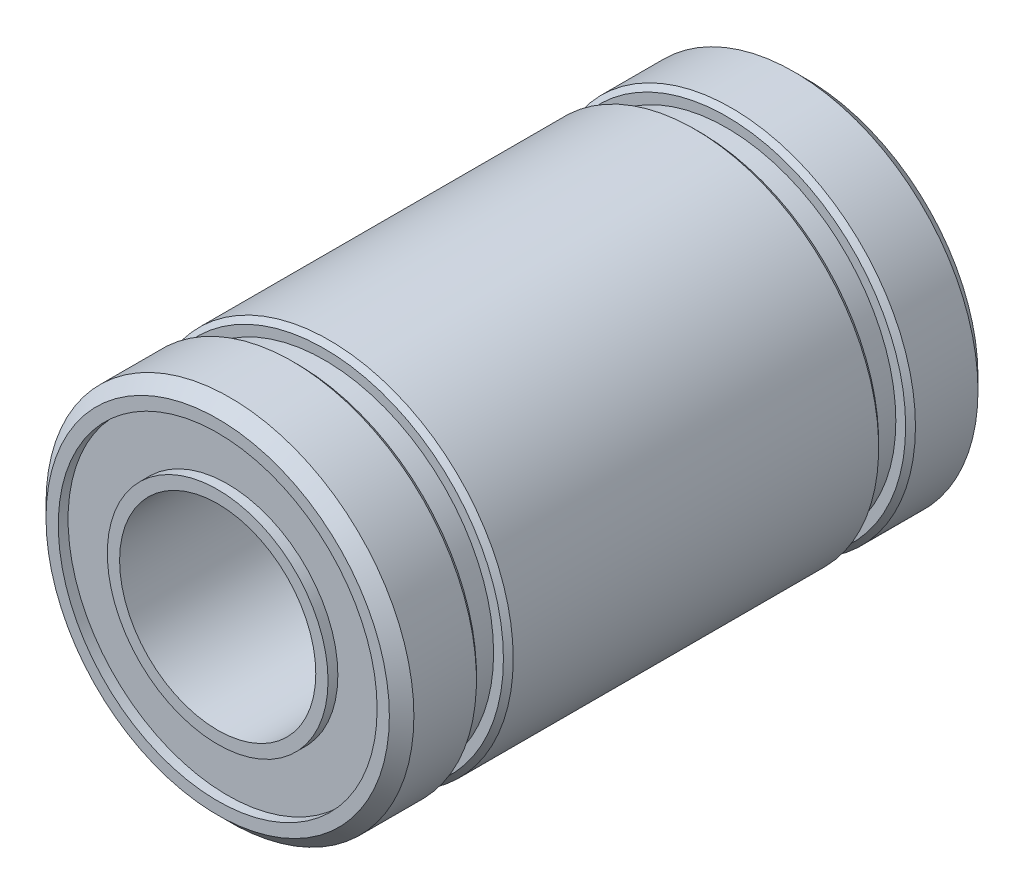
ISO-10303-21;
HEADER;
FILE_DESCRIPTION(('STEP AP214'),'2;1');
FILE_NAME('part.step','',(''),(''),'','','');
FILE_SCHEMA(('AUTOMOTIVE_DESIGN { 1 0 10303 214 1 1 1 1 }'));
ENDSEC;
DATA;
#1=APPLICATION_CONTEXT('core data for automotive mechanical design processes');
#2=APPLICATION_PROTOCOL_DEFINITION('international standard','automotive_design',2000,#1);
#3=PRODUCT_CONTEXT('',#1,'mechanical');
#4=PRODUCT('Part','Part','',(#3));
#5=PRODUCT_RELATED_PRODUCT_CATEGORY('part','',(#4));
#6=PRODUCT_DEFINITION_FORMATION('','',#4);
#7=PRODUCT_DEFINITION_CONTEXT('part definition',#1,'design');
#8=PRODUCT_DEFINITION('design','',#6,#7);
#9=PRODUCT_DEFINITION_SHAPE('','',#8);
#10=(LENGTH_UNIT() NAMED_UNIT(*) SI_UNIT(.MILLI.,.METRE.));
#11=(NAMED_UNIT(*) PLANE_ANGLE_UNIT() SI_UNIT($,.RADIAN.));
#12=(NAMED_UNIT(*) SI_UNIT($,.STERADIAN.) SOLID_ANGLE_UNIT());
#13=UNCERTAINTY_MEASURE_WITH_UNIT(LENGTH_MEASURE(1.E-05),#10,'distance_accuracy_value','');
#14=(GEOMETRIC_REPRESENTATION_CONTEXT(3) GLOBAL_UNCERTAINTY_ASSIGNED_CONTEXT((#13)) GLOBAL_UNIT_ASSIGNED_CONTEXT((#10,
#11,#12)) REPRESENTATION_CONTEXT('',''));
#15=CARTESIAN_POINT('',(0.,0.,0.));
#16=DIRECTION('',(0.,0.,1.));
#17=DIRECTION('',(1.,0.,0.));
#18=AXIS2_PLACEMENT_3D('',#15,#16,#17);
#19=CARTESIAN_POINT('',(0.,0.,24.));
#20=DIRECTION('',(0.,0.,-1.));
#21=DIRECTION('',(-1.,0.,0.));
#22=AXIS2_PLACEMENT_3D('',#19,#20,#21);
#23=CYLINDRICAL_SURFACE('',#22,7.5);
#24=CARTESIAN_POINT('',(0.,0.,20.95));
#25=DIRECTION('',(0.,0.,-1.));
#26=DIRECTION('',(-1.,0.,0.));
#27=AXIS2_PLACEMENT_3D('',#24,#25,#26);
#28=CIRCLE('',#27,7.5);
#29=CARTESIAN_POINT('',(-7.5,0.,20.95));
#30=VERTEX_POINT('',#29);
#31=EDGE_CURVE('E53',#30,#30,#28,.F.);
#32=ORIENTED_EDGE('',*,*,#31,.T.);
#33=EDGE_LOOP('',(#32));
#34=FACE_BOUND('',#33,.T.);
#35=CARTESIAN_POINT('',(0.,0.,23.5));
#36=DIRECTION('',(0.,0.,1.));
#37=DIRECTION('',(1.,0.,0.));
#38=AXIS2_PLACEMENT_3D('',#35,#36,#37);
#39=CIRCLE('',#38,7.5);
#40=CARTESIAN_POINT('',(7.5,0.,23.5));
#41=VERTEX_POINT('',#40);
#42=EDGE_CURVE('E78',#41,#41,#39,.F.);
#43=ORIENTED_EDGE('',*,*,#42,.T.);
#44=EDGE_LOOP('',(#43));
#45=FACE_BOUND('',#44,.T.);
#46=ADVANCED_FACE('F45',(#34,#45),#23,.T.);
#47=CARTESIAN_POINT('',(0.,0.,3.05));
#48=DIRECTION('',(0.,0.,1.));
#49=DIRECTION('',(1.,0.,0.));
#50=AXIS2_PLACEMENT_3D('',#47,#48,#49);
#51=CIRCLE('',#50,7.5);
#52=CARTESIAN_POINT('',(7.5,0.,3.05));
#53=VERTEX_POINT('',#52);
#54=EDGE_CURVE('E72',#53,#53,#51,.F.);
#55=ORIENTED_EDGE('',*,*,#54,.T.);
#56=EDGE_LOOP('',(#55));
#57=FACE_BOUND('',#56,.T.);
#58=CARTESIAN_POINT('',(0.,0.,0.500000000000004));
#59=DIRECTION('',(0.,0.,1.));
#60=DIRECTION('',(1.,0.,0.));
#61=AXIS2_PLACEMENT_3D('',#58,#59,#60);
#62=CIRCLE('',#61,7.5);
#63=CARTESIAN_POINT('',(7.5,0.,0.500000000000004));
#64=VERTEX_POINT('',#63);
#65=EDGE_CURVE('E87',#64,#64,#62,.T.);
#66=ORIENTED_EDGE('',*,*,#65,.T.);
#67=EDGE_LOOP('',(#66));
#68=FACE_BOUND('',#67,.T.);
#69=ADVANCED_FACE('F151',(#57,#68),#23,.T.);
#70=CARTESIAN_POINT('',(0.,0.,0.));
#71=DIRECTION('',(0.,0.,1.));
#72=DIRECTION('',(1.,0.,0.));
#73=AXIS2_PLACEMENT_3D('',#70,#71,#72);
#74=PLANE('',#73);
#75=CARTESIAN_POINT('',(0.,0.,0.));
#76=DIRECTION('',(0.,0.,1.));
#77=DIRECTION('',(1.,0.,0.));
#78=AXIS2_PLACEMENT_3D('',#75,#76,#77);
#79=CIRCLE('',#78,4.);
#80=CARTESIAN_POINT('',(4.,0.,0.));
#81=VERTEX_POINT('',#80);
#82=EDGE_CURVE('E103',#81,#81,#79,.T.);
#83=ORIENTED_EDGE('',*,*,#82,.T.);
#84=EDGE_LOOP('',(#83));
#85=FACE_BOUND('',#84,.T.);
#86=CARTESIAN_POINT('',(0.,0.,0.));
#87=DIRECTION('',(0.,0.,1.));
#88=DIRECTION('',(1.,0.,0.));
#89=AXIS2_PLACEMENT_3D('',#86,#87,#88);
#90=CIRCLE('',#89,4.5);
#91=CARTESIAN_POINT('',(4.5,0.,0.));
#92=VERTEX_POINT('',#91);
#93=EDGE_CURVE('E90',#92,#92,#90,.T.);
#94=ORIENTED_EDGE('',*,*,#93,.F.);
#95=EDGE_LOOP('',(#94));
#96=FACE_BOUND('',#95,.T.);
#97=ADVANCED_FACE('F157',(#85,#96),#74,.F.);
#98=CARTESIAN_POINT('',(0.,0.,0.400000000000001));
#99=DIRECTION('',(0.,0.,-1.));
#100=DIRECTION('',(1.,0.,0.));
#101=AXIS2_PLACEMENT_3D('',#98,#99,#100);
#102=CYLINDRICAL_SURFACE('',#101,4.5);
#103=CARTESIAN_POINT('',(0.,0.,0.400000000000001));
#104=DIRECTION('',(0.,0.,1.));
#105=DIRECTION('',(1.,0.,0.));
#106=AXIS2_PLACEMENT_3D('',#103,#104,#105);
#107=CIRCLE('',#106,4.5);
#108=CARTESIAN_POINT('',(4.5,0.,0.400000000000001));
#109=VERTEX_POINT('',#108);
#110=EDGE_CURVE('E93',#109,#109,#107,.T.);
#111=ORIENTED_EDGE('',*,*,#110,.F.);
#112=EDGE_LOOP('',(#111));
#113=FACE_BOUND('',#112,.T.);
#114=ORIENTED_EDGE('',*,*,#93,.T.);
#115=EDGE_LOOP('',(#114));
#116=FACE_BOUND('',#115,.T.);
#117=ADVANCED_FACE('F212',(#113,#116),#102,.T.);
#118=CARTESIAN_POINT('',(0.,0.,0.400000000000001));
#119=DIRECTION('',(0.,0.,-1.));
#120=DIRECTION('',(1.,0.,0.));
#121=AXIS2_PLACEMENT_3D('',#118,#119,#120);
#122=PLANE('',#121);
#123=ORIENTED_EDGE('',*,*,#110,.T.);
#124=EDGE_LOOP('',(#123));
#125=FACE_BOUND('',#124,.T.);
#126=CARTESIAN_POINT('',(0.,0.,0.400000000000001));
#127=DIRECTION('',(0.,0.,1.));
#128=DIRECTION('',(1.,0.,0.));
#129=AXIS2_PLACEMENT_3D('',#126,#127,#128);
#130=CIRCLE('',#129,6.5);
#131=CARTESIAN_POINT('',(6.5,0.,0.400000000000001));
#132=VERTEX_POINT('',#131);
#133=EDGE_CURVE('E99',#132,#132,#130,.T.);
#134=ORIENTED_EDGE('',*,*,#133,.F.);
#135=EDGE_LOOP('',(#134));
#136=FACE_BOUND('',#135,.T.);
#137=ADVANCED_FACE('F215',(#125,#136),#122,.T.);
#138=CARTESIAN_POINT('',(0.,0.,0.400000000000001));
#139=DIRECTION('',(0.,0.,-1.));
#140=DIRECTION('',(1.,0.,0.));
#141=AXIS2_PLACEMENT_3D('',#138,#139,#140);
#142=CYLINDRICAL_SURFACE('',#141,6.5);
#143=ORIENTED_EDGE('',*,*,#133,.T.);
#144=EDGE_LOOP('',(#143));
#145=FACE_BOUND('',#144,.T.);
#146=CARTESIAN_POINT('',(0.,0.,0.));
#147=DIRECTION('',(0.,0.,1.));
#148=DIRECTION('',(1.,0.,0.));
#149=AXIS2_PLACEMENT_3D('',#146,#147,#148);
#150=CIRCLE('',#149,6.5);
#151=CARTESIAN_POINT('',(6.5,0.,0.));
#152=VERTEX_POINT('',#151);
#153=EDGE_CURVE('E96',#152,#152,#150,.T.);
#154=ORIENTED_EDGE('',*,*,#153,.F.);
#155=EDGE_LOOP('',(#154));
#156=FACE_BOUND('',#155,.T.);
#157=ADVANCED_FACE('F218',(#145,#156),#142,.F.);
#158=CARTESIAN_POINT('',(0.,0.,24.));
#159=DIRECTION('',(0.,0.,1.));
#160=DIRECTION('',(1.,0.,0.));
#161=AXIS2_PLACEMENT_3D('',#158,#159,#160);
#162=PLANE('',#161);
#163=CARTESIAN_POINT('',(0.,0.,24.));
#164=DIRECTION('',(0.,0.,1.));
#165=DIRECTION('',(1.,0.,0.));
#166=AXIS2_PLACEMENT_3D('',#163,#164,#165);
#167=CIRCLE('',#166,4.);
#168=CARTESIAN_POINT('',(4.,0.,24.));
#169=VERTEX_POINT('',#168);
#170=EDGE_CURVE('E102',#169,#169,#167,.T.);
#171=ORIENTED_EDGE('',*,*,#170,.F.);
#172=EDGE_LOOP('',(#171));
#173=FACE_BOUND('',#172,.T.);
#174=CARTESIAN_POINT('',(0.,0.,24.));
#175=DIRECTION('',(0.,0.,1.));
#176=DIRECTION('',(1.,0.,0.));
#177=AXIS2_PLACEMENT_3D('',#174,#175,#176);
#178=CIRCLE('',#177,4.5);
#179=CARTESIAN_POINT('',(4.5,0.,24.));
#180=VERTEX_POINT('',#179);
#181=EDGE_CURVE('E115',#180,#180,#178,.T.);
#182=ORIENTED_EDGE('',*,*,#181,.T.);
#183=EDGE_LOOP('',(#182));
#184=FACE_BOUND('',#183,.T.);
#185=ADVANCED_FACE('F221',(#173,#184),#162,.T.);
#186=CARTESIAN_POINT('',(0.,0.,24.));
#187=DIRECTION('',(0.,0.,1.));
#188=DIRECTION('',(1.,0.,0.));
#189=AXIS2_PLACEMENT_3D('',#186,#187,#188);
#190=CIRCLE('',#189,7.);
#191=CARTESIAN_POINT('',(7.,0.,24.));
#192=VERTEX_POINT('',#191);
#193=EDGE_CURVE('E81',#192,#192,#190,.T.);
#194=ORIENTED_EDGE('',*,*,#193,.T.);
#195=EDGE_LOOP('',(#194));
#196=FACE_BOUND('',#195,.T.);
#197=CARTESIAN_POINT('',(0.,0.,24.));
#198=DIRECTION('',(0.,0.,1.));
#199=DIRECTION('',(1.,0.,0.));
#200=AXIS2_PLACEMENT_3D('',#197,#198,#199);
#201=CIRCLE('',#200,6.5);
#202=CARTESIAN_POINT('',(6.5,0.,24.));
#203=VERTEX_POINT('',#202);
#204=EDGE_CURVE('E109',#203,#203,#201,.T.);
#205=ORIENTED_EDGE('',*,*,#204,.F.);
#206=EDGE_LOOP('',(#205));
#207=FACE_BOUND('',#206,.T.);
#208=ADVANCED_FACE('F227',(#196,#207),#162,.T.);
#209=CARTESIAN_POINT('',(0.,0.,0.));
#210=DIRECTION('',(0.,0.,1.));
#211=DIRECTION('',(1.,0.,0.));
#212=AXIS2_PLACEMENT_3D('',#209,#210,#211);
#213=CIRCLE('',#212,7.);
#214=CARTESIAN_POINT('',(7.,0.,0.));
#215=VERTEX_POINT('',#214);
#216=EDGE_CURVE('E84',#215,#215,#213,.F.);
#217=ORIENTED_EDGE('',*,*,#216,.T.);
#218=EDGE_LOOP('',(#217));
#219=FACE_BOUND('',#218,.T.);
#220=ORIENTED_EDGE('',*,*,#153,.T.);
#221=EDGE_LOOP('',(#220));
#222=FACE_BOUND('',#221,.T.);
#223=ADVANCED_FACE('F234',(#219,#222),#74,.F.);
#224=CARTESIAN_POINT('',(0.,0.,24.));
#225=DIRECTION('',(0.,0.,-1.));
#226=DIRECTION('',(-1.,0.,0.));
#227=AXIS2_PLACEMENT_3D('',#224,#225,#226);
#228=CYLINDRICAL_SURFACE('',#227,4.);
#229=ORIENTED_EDGE('',*,*,#170,.T.);
#230=EDGE_LOOP('',(#229));
#231=FACE_BOUND('',#230,.T.);
#232=ORIENTED_EDGE('',*,*,#82,.F.);
#233=EDGE_LOOP('',(#232));
#234=FACE_BOUND('',#233,.T.);
#235=ADVANCED_FACE('F236',(#231,#234),#228,.F.);
#236=CARTESIAN_POINT('',(0.,0.,23.6));
#237=DIRECTION('',(0.,0.,1.));
#238=DIRECTION('',(1.,0.,0.));
#239=AXIS2_PLACEMENT_3D('',#236,#237,#238);
#240=CYLINDRICAL_SURFACE('',#239,6.5);
#241=CARTESIAN_POINT('',(0.,0.,23.6));
#242=DIRECTION('',(0.,0.,1.));
#243=DIRECTION('',(1.,0.,0.));
#244=AXIS2_PLACEMENT_3D('',#241,#242,#243);
#245=CIRCLE('',#244,6.5);
#246=CARTESIAN_POINT('',(6.5,0.,23.6));
#247=VERTEX_POINT('',#246);
#248=EDGE_CURVE('E106',#247,#247,#245,.T.);
#249=ORIENTED_EDGE('',*,*,#248,.F.);
#250=EDGE_LOOP('',(#249));
#251=FACE_BOUND('',#250,.T.);
#252=ORIENTED_EDGE('',*,*,#204,.T.);
#253=EDGE_LOOP('',(#252));
#254=FACE_BOUND('',#253,.T.);
#255=ADVANCED_FACE('F242',(#251,#254),#240,.F.);
#256=CARTESIAN_POINT('',(0.,0.,23.6));
#257=DIRECTION('',(0.,0.,1.));
#258=DIRECTION('',(1.,0.,0.));
#259=AXIS2_PLACEMENT_3D('',#256,#257,#258);
#260=PLANE('',#259);
#261=CARTESIAN_POINT('',(0.,0.,23.6));
#262=DIRECTION('',(0.,0.,1.));
#263=DIRECTION('',(1.,0.,0.));
#264=AXIS2_PLACEMENT_3D('',#261,#262,#263);
#265=CIRCLE('',#264,4.5);
#266=CARTESIAN_POINT('',(4.5,0.,23.6));
#267=VERTEX_POINT('',#266);
#268=EDGE_CURVE('E112',#267,#267,#265,.T.);
#269=ORIENTED_EDGE('',*,*,#268,.F.);
#270=EDGE_LOOP('',(#269));
#271=FACE_BOUND('',#270,.T.);
#272=ORIENTED_EDGE('',*,*,#248,.T.);
#273=EDGE_LOOP('',(#272));
#274=FACE_BOUND('',#273,.T.);
#275=ADVANCED_FACE('F394',(#271,#274),#260,.T.);
#276=CARTESIAN_POINT('',(0.,0.,23.6));
#277=DIRECTION('',(0.,0.,1.));
#278=DIRECTION('',(1.,0.,0.));
#279=AXIS2_PLACEMENT_3D('',#276,#277,#278);
#280=CYLINDRICAL_SURFACE('',#279,4.5);
#281=ORIENTED_EDGE('',*,*,#268,.T.);
#282=EDGE_LOOP('',(#281));
#283=FACE_BOUND('',#282,.T.);
#284=ORIENTED_EDGE('',*,*,#181,.F.);
#285=EDGE_LOOP('',(#284));
#286=FACE_BOUND('',#285,.T.);
#287=ADVANCED_FACE('F300',(#283,#286),#280,.T.);
#288=CARTESIAN_POINT('',(0.,7.5,4.35));
#289=DIRECTION('',(0.,0.,-1.));
#290=DIRECTION('',(-1.,0.,0.));
#291=AXIS2_PLACEMENT_3D('',#288,#289,#290);
#292=PLANE('',#291);
#293=CARTESIAN_POINT('',(0.,0.,4.35));
#294=DIRECTION('',(0.,0.,-1.));
#295=DIRECTION('',(-1.,0.,0.));
#296=AXIS2_PLACEMENT_3D('',#293,#294,#295);
#297=CIRCLE('',#296,7.3);
#298=CARTESIAN_POINT('',(-7.3,0.,4.35));
#299=VERTEX_POINT('',#298);
#300=EDGE_CURVE('E61',#299,#299,#297,.T.);
#301=ORIENTED_EDGE('',*,*,#300,.T.);
#302=EDGE_LOOP('',(#301));
#303=FACE_BOUND('',#302,.T.);
#304=CARTESIAN_POINT('',(0.,0.,4.35));
#305=DIRECTION('',(0.,0.,1.));
#306=DIRECTION('',(1.,0.,0.));
#307=AXIS2_PLACEMENT_3D('',#304,#305,#306);
#308=CIRCLE('',#307,6.9);
#309=CARTESIAN_POINT('',(6.9,0.,4.35));
#310=VERTEX_POINT('',#309);
#311=EDGE_CURVE('E121',#310,#310,#308,.T.);
#312=ORIENTED_EDGE('',*,*,#311,.T.);
#313=EDGE_LOOP('',(#312));
#314=FACE_BOUND('',#313,.T.);
#315=ADVANCED_FACE('F295',(#303,#314),#292,.T.);
#316=CARTESIAN_POINT('',(0.,0.,24.));
#317=DIRECTION('',(0.,0.,1.));
#318=DIRECTION('',(1.,0.,0.));
#319=AXIS2_PLACEMENT_3D('',#316,#317,#318);
#320=CYLINDRICAL_SURFACE('',#319,6.9);
#321=CARTESIAN_POINT('',(0.,0.,3.25));
#322=DIRECTION('',(0.,0.,1.));
#323=DIRECTION('',(1.,0.,0.));
#324=AXIS2_PLACEMENT_3D('',#321,#322,#323);
#325=CIRCLE('',#324,6.9);
#326=CARTESIAN_POINT('',(6.9,0.,3.25));
#327=VERTEX_POINT('',#326);
#328=EDGE_CURVE('E125',#327,#327,#325,.T.);
#329=ORIENTED_EDGE('',*,*,#328,.T.);
#330=EDGE_LOOP('',(#329));
#331=FACE_BOUND('',#330,.T.);
#332=ORIENTED_EDGE('',*,*,#311,.F.);
#333=EDGE_LOOP('',(#332));
#334=FACE_BOUND('',#333,.T.);
#335=ADVANCED_FACE('F170',(#331,#334),#320,.T.);
#336=CARTESIAN_POINT('',(0.,7.5,3.25));
#337=DIRECTION('',(0.,0.,1.));
#338=DIRECTION('',(1.,0.,0.));
#339=AXIS2_PLACEMENT_3D('',#336,#337,#338);
#340=PLANE('',#339);
#341=CARTESIAN_POINT('',(0.,0.,3.25));
#342=DIRECTION('',(0.,0.,1.));
#343=DIRECTION('',(1.,0.,0.));
#344=AXIS2_PLACEMENT_3D('',#341,#342,#343);
#345=CIRCLE('',#344,7.3);
#346=CARTESIAN_POINT('',(7.3,0.,3.25));
#347=VERTEX_POINT('',#346);
#348=EDGE_CURVE('E75',#347,#347,#345,.T.);
#349=ORIENTED_EDGE('',*,*,#348,.T.);
#350=EDGE_LOOP('',(#349));
#351=FACE_BOUND('',#350,.T.);
#352=ORIENTED_EDGE('',*,*,#328,.F.);
#353=EDGE_LOOP('',(#352));
#354=FACE_BOUND('',#353,.T.);
#355=ADVANCED_FACE('F163',(#351,#354),#340,.T.);
#356=CARTESIAN_POINT('',(0.,0.,4.55));
#357=DIRECTION('',(0.,0.,-1.));
#358=DIRECTION('',(-1.,0.,0.));
#359=AXIS2_PLACEMENT_3D('',#356,#357,#358);
#360=CIRCLE('',#359,7.5);
#361=CARTESIAN_POINT('',(-7.5,0.,4.55));
#362=VERTEX_POINT('',#361);
#363=EDGE_CURVE('E66',#362,#362,#360,.F.);
#364=ORIENTED_EDGE('',*,*,#363,.T.);
#365=EDGE_LOOP('',(#364));
#366=FACE_BOUND('',#365,.T.);
#367=CARTESIAN_POINT('',(0.,0.,19.45));
#368=DIRECTION('',(0.,0.,1.));
#369=DIRECTION('',(1.,0.,0.));
#370=AXIS2_PLACEMENT_3D('',#367,#368,#369);
#371=CIRCLE('',#370,7.5);
#372=CARTESIAN_POINT('',(7.5,0.,19.45));
#373=VERTEX_POINT('',#372);
#374=EDGE_CURVE('E69',#373,#373,#371,.F.);
#375=ORIENTED_EDGE('',*,*,#374,.T.);
#376=EDGE_LOOP('',(#375));
#377=FACE_BOUND('',#376,.T.);
#378=ADVANCED_FACE('F153',(#366,#377),#23,.T.);
#379=CARTESIAN_POINT('',(0.,7.5,20.75));
#380=DIRECTION('',(0.,0.,-1.));
#381=DIRECTION('',(-1.,0.,0.));
#382=AXIS2_PLACEMENT_3D('',#379,#380,#381);
#383=PLANE('',#382);
#384=CARTESIAN_POINT('',(0.,0.,20.75));
#385=DIRECTION('',(0.,0.,-1.));
#386=DIRECTION('',(-1.,0.,0.));
#387=AXIS2_PLACEMENT_3D('',#384,#385,#386);
#388=CIRCLE('',#387,7.29999999999999);
#389=CARTESIAN_POINT('',(-7.29999999999999,0.,20.75));
#390=VERTEX_POINT('',#389);
#391=EDGE_CURVE('E10',#390,#390,#388,.T.);
#392=ORIENTED_EDGE('',*,*,#391,.T.);
#393=EDGE_LOOP('',(#392));
#394=FACE_BOUND('',#393,.T.);
#395=CARTESIAN_POINT('',(0.,0.,20.75));
#396=DIRECTION('',(0.,0.,1.));
#397=DIRECTION('',(1.,0.,0.));
#398=AXIS2_PLACEMENT_3D('',#395,#396,#397);
#399=CIRCLE('',#398,6.9);
#400=CARTESIAN_POINT('',(6.9,0.,20.75));
#401=VERTEX_POINT('',#400);
#402=EDGE_CURVE('E118',#401,#401,#399,.T.);
#403=ORIENTED_EDGE('',*,*,#402,.T.);
#404=EDGE_LOOP('',(#403));
#405=FACE_BOUND('',#404,.T.);
#406=ADVANCED_FACE('F148',(#394,#405),#383,.T.);
#407=CARTESIAN_POINT('',(0.,0.,24.));
#408=DIRECTION('',(0.,0.,1.));
#409=DIRECTION('',(1.,0.,0.));
#410=AXIS2_PLACEMENT_3D('',#407,#408,#409);
#411=CYLINDRICAL_SURFACE('',#410,6.9);
#412=CARTESIAN_POINT('',(0.,0.,19.65));
#413=DIRECTION('',(0.,0.,1.));
#414=DIRECTION('',(1.,0.,0.));
#415=AXIS2_PLACEMENT_3D('',#412,#413,#414);
#416=CIRCLE('',#415,6.9);
#417=CARTESIAN_POINT('',(6.9,0.,19.65));
#418=VERTEX_POINT('',#417);
#419=EDGE_CURVE('E124',#418,#418,#416,.T.);
#420=ORIENTED_EDGE('',*,*,#419,.T.);
#421=EDGE_LOOP('',(#420));
#422=FACE_BOUND('',#421,.T.);
#423=ORIENTED_EDGE('',*,*,#402,.F.);
#424=EDGE_LOOP('',(#423));
#425=FACE_BOUND('',#424,.T.);
#426=ADVANCED_FACE('F133',(#422,#425),#411,.T.);
#427=CARTESIAN_POINT('',(0.,7.5,19.65));
#428=DIRECTION('',(0.,0.,1.));
#429=DIRECTION('',(1.,0.,0.));
#430=AXIS2_PLACEMENT_3D('',#427,#428,#429);
#431=PLANE('',#430);
#432=CARTESIAN_POINT('',(0.,0.,19.65));
#433=DIRECTION('',(0.,0.,1.));
#434=DIRECTION('',(1.,0.,0.));
#435=AXIS2_PLACEMENT_3D('',#432,#433,#434);
#436=CIRCLE('',#435,7.3);
#437=CARTESIAN_POINT('',(7.3,0.,19.65));
#438=VERTEX_POINT('',#437);
#439=EDGE_CURVE('E57',#438,#438,#436,.T.);
#440=ORIENTED_EDGE('',*,*,#439,.T.);
#441=EDGE_LOOP('',(#440));
#442=FACE_BOUND('',#441,.T.);
#443=ORIENTED_EDGE('',*,*,#419,.F.);
#444=EDGE_LOOP('',(#443));
#445=FACE_BOUND('',#444,.T.);
#446=ADVANCED_FACE('F136',(#442,#445),#431,.T.);
#447=CARTESIAN_POINT('',(0.,0.,0.500000000000004));
#448=DIRECTION('',(0.,0.,1.));
#449=DIRECTION('',(1.,0.,0.));
#450=AXIS2_PLACEMENT_3D('',#447,#448,#449);
#451=CONICAL_SURFACE('',#450,7.5,0.785398163397447);
#452=ORIENTED_EDGE('',*,*,#216,.F.);
#453=EDGE_LOOP('',(#452));
#454=FACE_BOUND('',#453,.T.);
#455=ORIENTED_EDGE('',*,*,#65,.F.);
#456=EDGE_LOOP('',(#455));
#457=FACE_BOUND('',#456,.T.);
#458=ADVANCED_FACE('F138',(#454,#457),#451,.T.);
#459=CARTESIAN_POINT('',(0.,0.,24.));
#460=DIRECTION('',(0.,0.,-1.));
#461=DIRECTION('',(-1.,0.,0.));
#462=AXIS2_PLACEMENT_3D('',#459,#460,#461);
#463=CONICAL_SURFACE('',#462,7.,0.785398163397449);
#464=ORIENTED_EDGE('',*,*,#42,.F.);
#465=EDGE_LOOP('',(#464));
#466=FACE_BOUND('',#465,.T.);
#467=ORIENTED_EDGE('',*,*,#193,.F.);
#468=EDGE_LOOP('',(#467));
#469=FACE_BOUND('',#468,.T.);
#470=ADVANCED_FACE('F145',(#466,#469),#463,.T.);
#471=CARTESIAN_POINT('',(0.,0.,3.25));
#472=DIRECTION('',(0.,0.,-1.));
#473=DIRECTION('',(-1.,0.,0.));
#474=AXIS2_PLACEMENT_3D('',#471,#472,#473);
#475=CONICAL_SURFACE('',#474,7.3,0.785398163397448);
#476=ORIENTED_EDGE('',*,*,#54,.F.);
#477=EDGE_LOOP('',(#476));
#478=FACE_BOUND('',#477,.T.);
#479=ORIENTED_EDGE('',*,*,#348,.F.);
#480=EDGE_LOOP('',(#479));
#481=FACE_BOUND('',#480,.T.);
#482=ADVANCED_FACE('F187',(#478,#481),#475,.T.);
#483=CARTESIAN_POINT('',(0.,0.,4.55));
#484=DIRECTION('',(0.,0.,1.));
#485=DIRECTION('',(1.,0.,0.));
#486=AXIS2_PLACEMENT_3D('',#483,#484,#485);
#487=CONICAL_SURFACE('',#486,7.5,0.785398163397448);
#488=ORIENTED_EDGE('',*,*,#300,.F.);
#489=EDGE_LOOP('',(#488));
#490=FACE_BOUND('',#489,.T.);
#491=ORIENTED_EDGE('',*,*,#363,.F.);
#492=EDGE_LOOP('',(#491));
#493=FACE_BOUND('',#492,.T.);
#494=ADVANCED_FACE('F180',(#490,#493),#487,.T.);
#495=CARTESIAN_POINT('',(0.,0.,19.65));
#496=DIRECTION('',(0.,0.,-1.));
#497=DIRECTION('',(-1.,0.,0.));
#498=AXIS2_PLACEMENT_3D('',#495,#496,#497);
#499=CONICAL_SURFACE('',#498,7.3,0.78539816339744);
#500=ORIENTED_EDGE('',*,*,#374,.F.);
#501=EDGE_LOOP('',(#500));
#502=FACE_BOUND('',#501,.T.);
#503=ORIENTED_EDGE('',*,*,#439,.F.);
#504=EDGE_LOOP('',(#503));
#505=FACE_BOUND('',#504,.T.);
#506=ADVANCED_FACE('F177',(#502,#505),#499,.T.);
#507=CARTESIAN_POINT('',(0.,0.,20.95));
#508=DIRECTION('',(0.,0.,1.));
#509=DIRECTION('',(1.,0.,0.));
#510=AXIS2_PLACEMENT_3D('',#507,#508,#509);
#511=CONICAL_SURFACE('',#510,7.5,0.785398163397442);
#512=ORIENTED_EDGE('',*,*,#391,.F.);
#513=EDGE_LOOP('',(#512));
#514=FACE_BOUND('',#513,.T.);
#515=ORIENTED_EDGE('',*,*,#31,.F.);
#516=EDGE_LOOP('',(#515));
#517=FACE_BOUND('',#516,.T.);
#518=ADVANCED_FACE('F48',(#514,#517),#511,.T.);
#519=CLOSED_SHELL('',(#46,#69,#97,#117,#137,#157,#185,#208,#223,#235,#255,#275,#287,#315,#335,
#355,#378,#406,#426,#446,#458,#470,#482,#494,#506,#518));
#520=MANIFOLD_SOLID_BREP('B2',#519);
#521=ADVANCED_BREP_SHAPE_REPRESENTATION('',(#18,#520),#14);
#522=SHAPE_DEFINITION_REPRESENTATION(#9,#521);
ENDSEC;
END-ISO-10303-21;
